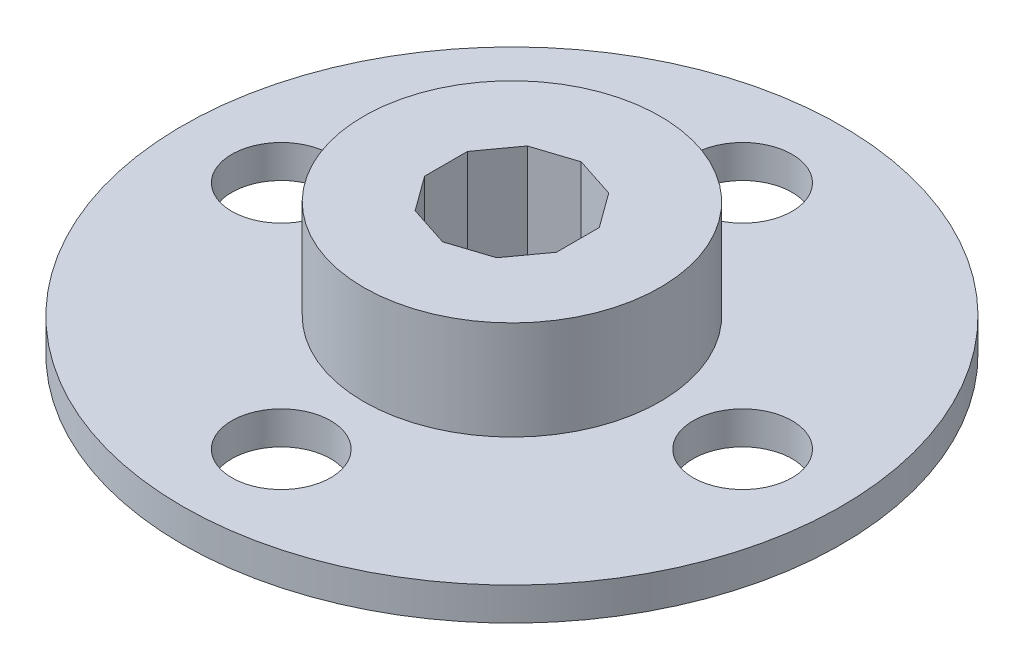
ISO-10303-21;
HEADER;
FILE_DESCRIPTION(('STEP AP214'),'2;1');
FILE_NAME('part.step','',(''),(''),'','','');
FILE_SCHEMA(('AUTOMOTIVE_DESIGN { 1 0 10303 214 1 1 1 1 }'));
ENDSEC;
DATA;
#1=APPLICATION_CONTEXT('core data for automotive mechanical design processes');
#2=APPLICATION_PROTOCOL_DEFINITION('international standard','automotive_design',2000,#1);
#3=PRODUCT_CONTEXT('',#1,'mechanical');
#4=PRODUCT('Part','Part','',(#3));
#5=PRODUCT_RELATED_PRODUCT_CATEGORY('part','',(#4));
#6=PRODUCT_DEFINITION_FORMATION('','',#4);
#7=PRODUCT_DEFINITION_CONTEXT('part definition',#1,'design');
#8=PRODUCT_DEFINITION('design','',#6,#7);
#9=PRODUCT_DEFINITION_SHAPE('','',#8);
#10=(LENGTH_UNIT() NAMED_UNIT(*) SI_UNIT(.MILLI.,.METRE.));
#11=(NAMED_UNIT(*) PLANE_ANGLE_UNIT() SI_UNIT($,.RADIAN.));
#12=(NAMED_UNIT(*) SI_UNIT($,.STERADIAN.) SOLID_ANGLE_UNIT());
#13=UNCERTAINTY_MEASURE_WITH_UNIT(LENGTH_MEASURE(1.E-05),#10,'distance_accuracy_value','');
#14=(GEOMETRIC_REPRESENTATION_CONTEXT(3) GLOBAL_UNCERTAINTY_ASSIGNED_CONTEXT((#13)) GLOBAL_UNIT_ASSIGNED_CONTEXT((#10,
#11,#12)) REPRESENTATION_CONTEXT('',''));
#15=CARTESIAN_POINT('',(0.,0.,0.));
#16=DIRECTION('',(0.,0.,1.));
#17=DIRECTION('',(1.,0.,0.));
#18=AXIS2_PLACEMENT_3D('',#15,#16,#17);
#19=CARTESIAN_POINT('',(0.,4.,0.));
#20=DIRECTION('',(0.,1.,0.));
#21=DIRECTION('',(0.,0.,1.));
#22=AXIS2_PLACEMENT_3D('',#19,#20,#21);
#23=PLANE('',#22);
#24=CARTESIAN_POINT('',(0.,4.,0.));
#25=DIRECTION('',(0.,1.,0.));
#26=DIRECTION('',(0.,0.,1.));
#27=AXIS2_PLACEMENT_3D('',#24,#25,#26);
#28=CIRCLE('',#27,4.5);
#29=CARTESIAN_POINT('',(0.,4.,4.5));
#30=VERTEX_POINT('',#29);
#31=EDGE_CURVE('E12',#30,#30,#28,.T.);
#32=ORIENTED_EDGE('',*,*,#31,.T.);
#33=EDGE_LOOP('',(#32));
#34=FACE_BOUND('',#33,.T.);
#35=DIRECTION('',(-0.587785252292474,0.,-0.809016994374947));
#36=VECTOR('',#35,1.);
#37=CARTESIAN_POINT('',(2.,4.,-0.649839392465813));
#38=LINE('',#37,#36);
#39=CARTESIAN_POINT('',(2.,4.,-0.649839392465813));
#40=VERTEX_POINT('',#39);
#41=CARTESIAN_POINT('',(1.23606797749979,4.,-1.70130161670408));
#42=VERTEX_POINT('',#41);
#43=EDGE_CURVE('E129',#40,#42,#38,.T.);
#44=ORIENTED_EDGE('',*,*,#43,.F.);
#45=DIRECTION('',(0.,0.,-1.));
#46=VECTOR('',#45,1.);
#47=CARTESIAN_POINT('',(2.,4.,0.649839392465812));
#48=LINE('',#47,#46);
#49=CARTESIAN_POINT('',(2.,4.,0.649839392465812));
#50=VERTEX_POINT('',#49);
#51=EDGE_CURVE('E121',#50,#40,#48,.T.);
#52=ORIENTED_EDGE('',*,*,#51,.F.);
#53=DIRECTION('',(0.587785252292473,0.,-0.809016994374948));
#54=VECTOR('',#53,1.);
#55=CARTESIAN_POINT('',(1.23606797749979,4.,1.70130161670408));
#56=LINE('',#55,#54);
#57=CARTESIAN_POINT('',(1.23606797749979,4.,1.70130161670408));
#58=VERTEX_POINT('',#57);
#59=EDGE_CURVE('E157',#58,#50,#56,.T.);
#60=ORIENTED_EDGE('',*,*,#59,.F.);
#61=DIRECTION('',(0.951056516295153,0.,-0.309016994374948));
#62=VECTOR('',#61,1.);
#63=CARTESIAN_POINT('',(0.,4.,2.10292444847653));
#64=LINE('',#63,#62);
#65=CARTESIAN_POINT('',(0.,4.,2.10292444847653));
#66=VERTEX_POINT('',#65);
#67=EDGE_CURVE('E155',#66,#58,#64,.T.);
#68=ORIENTED_EDGE('',*,*,#67,.F.);
#69=DIRECTION('',(0.951056516295154,0.,0.309016994374947));
#70=VECTOR('',#69,1.);
#71=CARTESIAN_POINT('',(-1.23606797749979,4.,1.70130161670408));
#72=LINE('',#71,#70);
#73=CARTESIAN_POINT('',(-1.23606797749979,4.,1.70130161670408));
#74=VERTEX_POINT('',#73);
#75=EDGE_CURVE('E153',#74,#66,#72,.T.);
#76=ORIENTED_EDGE('',*,*,#75,.F.);
#77=DIRECTION('',(0.587785252292473,0.,0.809016994374947));
#78=VECTOR('',#77,1.);
#79=CARTESIAN_POINT('',(-2.,4.,0.649839392465813));
#80=LINE('',#79,#78);
#81=CARTESIAN_POINT('',(-2.,4.,0.649839392465813));
#82=VERTEX_POINT('',#81);
#83=EDGE_CURVE('E151',#82,#74,#80,.T.);
#84=ORIENTED_EDGE('',*,*,#83,.F.);
#85=DIRECTION('',(0.,0.,1.));
#86=VECTOR('',#85,1.);
#87=CARTESIAN_POINT('',(-2.,4.,-0.649839392465812));
#88=LINE('',#87,#86);
#89=CARTESIAN_POINT('',(-2.,4.,-0.649839392465812));
#90=VERTEX_POINT('',#89);
#91=EDGE_CURVE('E149',#90,#82,#88,.T.);
#92=ORIENTED_EDGE('',*,*,#91,.F.);
#93=DIRECTION('',(-0.587785252292473,0.,0.809016994374948));
#94=VECTOR('',#93,1.);
#95=CARTESIAN_POINT('',(-1.23606797749979,4.,-1.70130161670408));
#96=LINE('',#95,#94);
#97=CARTESIAN_POINT('',(-1.23606797749979,4.,-1.70130161670408));
#98=VERTEX_POINT('',#97);
#99=EDGE_CURVE('E147',#98,#90,#96,.T.);
#100=ORIENTED_EDGE('',*,*,#99,.F.);
#101=DIRECTION('',(-0.951056516295154,0.,0.309016994374948));
#102=VECTOR('',#101,1.);
#103=CARTESIAN_POINT('',(0.,4.,-2.10292444847653));
#104=LINE('',#103,#102);
#105=CARTESIAN_POINT('',(0.,4.,-2.10292444847653));
#106=VERTEX_POINT('',#105);
#107=EDGE_CURVE('E143',#106,#98,#104,.T.);
#108=ORIENTED_EDGE('',*,*,#107,.F.);
#109=DIRECTION('',(-0.951056516295154,0.,-0.309016994374947));
#110=VECTOR('',#109,1.);
#111=CARTESIAN_POINT('',(1.23606797749979,4.,-1.70130161670408));
#112=LINE('',#111,#110);
#113=EDGE_CURVE('E141',#42,#106,#112,.T.);
#114=ORIENTED_EDGE('',*,*,#113,.F.);
#115=EDGE_LOOP('',(#44,#52,#60,#68,#76,#84,#92,#100,#108,#114));
#116=FACE_BOUND('',#115,.T.);
#117=ADVANCED_FACE('F44',(#34,#116),#23,.T.);
#118=CARTESIAN_POINT('',(0.,1.,0.));
#119=DIRECTION('',(0.,1.,0.));
#120=DIRECTION('',(0.,0.,1.));
#121=AXIS2_PLACEMENT_3D('',#118,#119,#120);
#122=PLANE('',#121);
#123=CARTESIAN_POINT('',(0.,1.,0.));
#124=DIRECTION('',(0.,1.,0.));
#125=DIRECTION('',(0.,0.,1.));
#126=AXIS2_PLACEMENT_3D('',#123,#124,#125);
#127=CIRCLE('',#126,4.5);
#128=CARTESIAN_POINT('',(0.,1.,4.5));
#129=VERTEX_POINT('',#128);
#130=EDGE_CURVE('E48',#129,#129,#127,.T.);
#131=ORIENTED_EDGE('',*,*,#130,.F.);
#132=EDGE_LOOP('',(#131));
#133=FACE_BOUND('',#132,.T.);
#134=DIRECTION('',(0.,0.,-1.));
#135=VECTOR('',#134,1.);
#136=CARTESIAN_POINT('',(2.,1.,0.649839392465812));
#137=LINE('',#136,#135);
#138=CARTESIAN_POINT('',(2.,1.,0.649839392465812));
#139=VERTEX_POINT('',#138);
#140=CARTESIAN_POINT('',(2.,1.,-0.649839392465813));
#141=VERTEX_POINT('',#140);
#142=EDGE_CURVE('E67',#139,#141,#137,.T.);
#143=ORIENTED_EDGE('',*,*,#142,.T.);
#144=DIRECTION('',(-0.587785252292474,0.,-0.809016994374947));
#145=VECTOR('',#144,1.);
#146=CARTESIAN_POINT('',(2.,1.,-0.649839392465813));
#147=LINE('',#146,#145);
#148=CARTESIAN_POINT('',(1.23606797749979,1.,-1.70130161670408));
#149=VERTEX_POINT('',#148);
#150=EDGE_CURVE('E136',#141,#149,#147,.T.);
#151=ORIENTED_EDGE('',*,*,#150,.T.);
#152=DIRECTION('',(-0.951056516295154,0.,-0.309016994374947));
#153=VECTOR('',#152,1.);
#154=CARTESIAN_POINT('',(1.23606797749979,1.,-1.70130161670408));
#155=LINE('',#154,#153);
#156=CARTESIAN_POINT('',(0.,1.,-2.10292444847653));
#157=VERTEX_POINT('',#156);
#158=EDGE_CURVE('E161',#149,#157,#155,.T.);
#159=ORIENTED_EDGE('',*,*,#158,.T.);
#160=DIRECTION('',(-0.951056516295154,0.,0.309016994374948));
#161=VECTOR('',#160,1.);
#162=CARTESIAN_POINT('',(0.,1.,-2.10292444847653));
#163=LINE('',#162,#161);
#164=CARTESIAN_POINT('',(-1.23606797749979,1.,-1.70130161670408));
#165=VERTEX_POINT('',#164);
#166=EDGE_CURVE('E164',#157,#165,#163,.T.);
#167=ORIENTED_EDGE('',*,*,#166,.T.);
#168=DIRECTION('',(-0.587785252292473,0.,0.809016994374948));
#169=VECTOR('',#168,1.);
#170=CARTESIAN_POINT('',(-1.23606797749979,1.,-1.70130161670408));
#171=LINE('',#170,#169);
#172=CARTESIAN_POINT('',(-2.,1.,-0.649839392465812));
#173=VERTEX_POINT('',#172);
#174=EDGE_CURVE('E167',#165,#173,#171,.T.);
#175=ORIENTED_EDGE('',*,*,#174,.T.);
#176=DIRECTION('',(0.,0.,1.));
#177=VECTOR('',#176,1.);
#178=CARTESIAN_POINT('',(-2.,1.,-0.649839392465812));
#179=LINE('',#178,#177);
#180=CARTESIAN_POINT('',(-2.,1.,0.649839392465813));
#181=VERTEX_POINT('',#180);
#182=EDGE_CURVE('E170',#173,#181,#179,.T.);
#183=ORIENTED_EDGE('',*,*,#182,.T.);
#184=DIRECTION('',(0.587785252292473,0.,0.809016994374947));
#185=VECTOR('',#184,1.);
#186=CARTESIAN_POINT('',(-2.,1.,0.649839392465813));
#187=LINE('',#186,#185);
#188=CARTESIAN_POINT('',(-1.23606797749979,1.,1.70130161670408));
#189=VERTEX_POINT('',#188);
#190=EDGE_CURVE('E173',#181,#189,#187,.T.);
#191=ORIENTED_EDGE('',*,*,#190,.T.);
#192=DIRECTION('',(0.951056516295154,0.,0.309016994374947));
#193=VECTOR('',#192,1.);
#194=CARTESIAN_POINT('',(-1.23606797749979,1.,1.70130161670408));
#195=LINE('',#194,#193);
#196=CARTESIAN_POINT('',(0.,1.,2.10292444847653));
#197=VERTEX_POINT('',#196);
#198=EDGE_CURVE('E176',#189,#197,#195,.T.);
#199=ORIENTED_EDGE('',*,*,#198,.T.);
#200=DIRECTION('',(0.951056516295153,0.,-0.309016994374948));
#201=VECTOR('',#200,1.);
#202=CARTESIAN_POINT('',(0.,1.,2.10292444847653));
#203=LINE('',#202,#201);
#204=CARTESIAN_POINT('',(1.23606797749979,1.,1.70130161670408));
#205=VERTEX_POINT('',#204);
#206=EDGE_CURVE('E179',#197,#205,#203,.T.);
#207=ORIENTED_EDGE('',*,*,#206,.T.);
#208=DIRECTION('',(0.587785252292473,0.,-0.809016994374948));
#209=VECTOR('',#208,1.);
#210=CARTESIAN_POINT('',(1.23606797749979,1.,1.70130161670408));
#211=LINE('',#210,#209);
#212=EDGE_CURVE('E130',#205,#139,#211,.T.);
#213=ORIENTED_EDGE('',*,*,#212,.T.);
#214=EDGE_LOOP('',(#143,#151,#159,#167,#175,#183,#191,#199,#207,#213));
#215=FACE_BOUND('',#214,.T.);
#216=ADVANCED_FACE('F204',(#133,#215),#122,.F.);
#217=CARTESIAN_POINT('',(0.,4.,0.));
#218=DIRECTION('',(0.,-1.,0.));
#219=DIRECTION('',(0.,0.,-1.));
#220=AXIS2_PLACEMENT_3D('',#217,#218,#219);
#221=CYLINDRICAL_SURFACE('',#220,4.5);
#222=ORIENTED_EDGE('',*,*,#31,.F.);
#223=EDGE_LOOP('',(#222));
#224=FACE_BOUND('',#223,.T.);
#225=ORIENTED_EDGE('',*,*,#130,.T.);
#226=EDGE_LOOP('',(#225));
#227=FACE_BOUND('',#226,.T.);
#228=ADVANCED_FACE('F46',(#224,#227),#221,.T.);
#229=CARTESIAN_POINT('',(2.,4.,0.649839392465812));
#230=DIRECTION('',(-1.,0.,0.));
#231=DIRECTION('',(0.,0.,1.));
#232=AXIS2_PLACEMENT_3D('',#229,#230,#231);
#233=PLANE('',#232);
#234=ORIENTED_EDGE('',*,*,#142,.F.);
#235=DIRECTION('',(0.,-1.,0.));
#236=VECTOR('',#235,1.);
#237=CARTESIAN_POINT('',(2.,4.,0.649839392465812));
#238=LINE('',#237,#236);
#239=EDGE_CURVE('E125',#50,#139,#238,.T.);
#240=ORIENTED_EDGE('',*,*,#239,.F.);
#241=ORIENTED_EDGE('',*,*,#51,.T.);
#242=DIRECTION('',(0.,-1.,0.));
#243=VECTOR('',#242,1.);
#244=CARTESIAN_POINT('',(2.,4.,-0.649839392465813));
#245=LINE('',#244,#243);
#246=EDGE_CURVE('E124',#40,#141,#245,.T.);
#247=ORIENTED_EDGE('',*,*,#246,.T.);
#248=EDGE_LOOP('',(#234,#240,#241,#247));
#249=FACE_BOUND('',#248,.T.);
#250=ADVANCED_FACE('F123',(#249),#233,.T.);
#251=CARTESIAN_POINT('',(2.,4.,-0.649839392465813));
#252=DIRECTION('',(-0.809016994374947,0.,0.587785252292473));
#253=DIRECTION('',(0.587785252292474,0.,0.809016994374947));
#254=AXIS2_PLACEMENT_3D('',#251,#252,#253);
#255=PLANE('',#254);
#256=ORIENTED_EDGE('',*,*,#150,.F.);
#257=ORIENTED_EDGE('',*,*,#246,.F.);
#258=ORIENTED_EDGE('',*,*,#43,.T.);
#259=DIRECTION('',(0.,-1.,0.));
#260=VECTOR('',#259,1.);
#261=CARTESIAN_POINT('',(1.23606797749979,4.,-1.70130161670408));
#262=LINE('',#261,#260);
#263=EDGE_CURVE('E137',#42,#149,#262,.T.);
#264=ORIENTED_EDGE('',*,*,#263,.T.);
#265=EDGE_LOOP('',(#256,#257,#258,#264));
#266=FACE_BOUND('',#265,.T.);
#267=ADVANCED_FACE('F133',(#266),#255,.T.);
#268=CARTESIAN_POINT('',(1.23606797749979,4.,-1.70130161670408));
#269=DIRECTION('',(-0.309016994374947,0.,0.951056516295154));
#270=DIRECTION('',(0.951056516295154,0.,0.309016994374947));
#271=AXIS2_PLACEMENT_3D('',#268,#269,#270);
#272=PLANE('',#271);
#273=ORIENTED_EDGE('',*,*,#158,.F.);
#274=ORIENTED_EDGE('',*,*,#263,.F.);
#275=ORIENTED_EDGE('',*,*,#113,.T.);
#276=DIRECTION('',(0.,-1.,0.));
#277=VECTOR('',#276,1.);
#278=CARTESIAN_POINT('',(0.,4.,-2.10292444847653));
#279=LINE('',#278,#277);
#280=EDGE_CURVE('E196',#106,#157,#279,.T.);
#281=ORIENTED_EDGE('',*,*,#280,.T.);
#282=EDGE_LOOP('',(#273,#274,#275,#281));
#283=FACE_BOUND('',#282,.T.);
#284=ADVANCED_FACE('F200',(#283),#272,.T.);
#285=CARTESIAN_POINT('',(0.,4.,-2.10292444847653));
#286=DIRECTION('',(0.309016994374948,0.,0.951056516295153));
#287=DIRECTION('',(0.951056516295154,0.,-0.309016994374948));
#288=AXIS2_PLACEMENT_3D('',#285,#286,#287);
#289=PLANE('',#288);
#290=ORIENTED_EDGE('',*,*,#166,.F.);
#291=ORIENTED_EDGE('',*,*,#280,.F.);
#292=ORIENTED_EDGE('',*,*,#107,.T.);
#293=DIRECTION('',(0.,-1.,0.));
#294=VECTOR('',#293,1.);
#295=CARTESIAN_POINT('',(-1.23606797749979,4.,-1.70130161670408));
#296=LINE('',#295,#294);
#297=EDGE_CURVE('E194',#98,#165,#296,.T.);
#298=ORIENTED_EDGE('',*,*,#297,.T.);
#299=EDGE_LOOP('',(#290,#291,#292,#298));
#300=FACE_BOUND('',#299,.T.);
#301=ADVANCED_FACE('F232',(#300),#289,.T.);
#302=CARTESIAN_POINT('',(-1.23606797749979,4.,-1.70130161670408));
#303=DIRECTION('',(0.809016994374947,0.,0.587785252292473));
#304=DIRECTION('',(0.587785252292473,0.,-0.809016994374948));
#305=AXIS2_PLACEMENT_3D('',#302,#303,#304);
#306=PLANE('',#305);
#307=ORIENTED_EDGE('',*,*,#174,.F.);
#308=ORIENTED_EDGE('',*,*,#297,.F.);
#309=ORIENTED_EDGE('',*,*,#99,.T.);
#310=DIRECTION('',(0.,-1.,0.));
#311=VECTOR('',#310,1.);
#312=CARTESIAN_POINT('',(-2.,4.,-0.649839392465812));
#313=LINE('',#312,#311);
#314=EDGE_CURVE('E192',#90,#173,#313,.T.);
#315=ORIENTED_EDGE('',*,*,#314,.T.);
#316=EDGE_LOOP('',(#307,#308,#309,#315));
#317=FACE_BOUND('',#316,.T.);
#318=ADVANCED_FACE('F229',(#317),#306,.T.);
#319=CARTESIAN_POINT('',(-2.,4.,-0.649839392465812));
#320=DIRECTION('',(1.,0.,0.));
#321=DIRECTION('',(0.,0.,-1.));
#322=AXIS2_PLACEMENT_3D('',#319,#320,#321);
#323=PLANE('',#322);
#324=ORIENTED_EDGE('',*,*,#182,.F.);
#325=ORIENTED_EDGE('',*,*,#314,.F.);
#326=ORIENTED_EDGE('',*,*,#91,.T.);
#327=DIRECTION('',(0.,-1.,0.));
#328=VECTOR('',#327,1.);
#329=CARTESIAN_POINT('',(-2.,4.,0.649839392465813));
#330=LINE('',#329,#328);
#331=EDGE_CURVE('E190',#82,#181,#330,.T.);
#332=ORIENTED_EDGE('',*,*,#331,.T.);
#333=EDGE_LOOP('',(#324,#325,#326,#332));
#334=FACE_BOUND('',#333,.T.);
#335=ADVANCED_FACE('F226',(#334),#323,.T.);
#336=CARTESIAN_POINT('',(-2.,4.,0.649839392465813));
#337=DIRECTION('',(0.809016994374947,0.,-0.587785252292473));
#338=DIRECTION('',(-0.587785252292473,0.,-0.809016994374947));
#339=AXIS2_PLACEMENT_3D('',#336,#337,#338);
#340=PLANE('',#339);
#341=ORIENTED_EDGE('',*,*,#190,.F.);
#342=ORIENTED_EDGE('',*,*,#331,.F.);
#343=ORIENTED_EDGE('',*,*,#83,.T.);
#344=DIRECTION('',(0.,-1.,0.));
#345=VECTOR('',#344,1.);
#346=CARTESIAN_POINT('',(-1.23606797749979,4.,1.70130161670408));
#347=LINE('',#346,#345);
#348=EDGE_CURVE('E188',#74,#189,#347,.T.);
#349=ORIENTED_EDGE('',*,*,#348,.T.);
#350=EDGE_LOOP('',(#341,#342,#343,#349));
#351=FACE_BOUND('',#350,.T.);
#352=ADVANCED_FACE('F219',(#351),#340,.T.);
#353=CARTESIAN_POINT('',(-1.23606797749979,4.,1.70130161670408));
#354=DIRECTION('',(0.309016994374947,0.,-0.951056516295154));
#355=DIRECTION('',(-0.951056516295154,0.,-0.309016994374947));
#356=AXIS2_PLACEMENT_3D('',#353,#354,#355);
#357=PLANE('',#356);
#358=ORIENTED_EDGE('',*,*,#198,.F.);
#359=ORIENTED_EDGE('',*,*,#348,.F.);
#360=ORIENTED_EDGE('',*,*,#75,.T.);
#361=DIRECTION('',(0.,-1.,0.));
#362=VECTOR('',#361,1.);
#363=CARTESIAN_POINT('',(0.,4.,2.10292444847653));
#364=LINE('',#363,#362);
#365=EDGE_CURVE('E186',#66,#197,#364,.T.);
#366=ORIENTED_EDGE('',*,*,#365,.T.);
#367=EDGE_LOOP('',(#358,#359,#360,#366));
#368=FACE_BOUND('',#367,.T.);
#369=ADVANCED_FACE('F215',(#368),#357,.T.);
#370=CARTESIAN_POINT('',(0.,4.,2.10292444847653));
#371=DIRECTION('',(-0.309016994374948,0.,-0.951056516295154));
#372=DIRECTION('',(-0.951056516295154,0.,0.309016994374948));
#373=AXIS2_PLACEMENT_3D('',#370,#371,#372);
#374=PLANE('',#373);
#375=ORIENTED_EDGE('',*,*,#206,.F.);
#376=ORIENTED_EDGE('',*,*,#365,.F.);
#377=ORIENTED_EDGE('',*,*,#67,.T.);
#378=DIRECTION('',(0.,-1.,0.));
#379=VECTOR('',#378,1.);
#380=CARTESIAN_POINT('',(1.23606797749979,4.,1.70130161670408));
#381=LINE('',#380,#379);
#382=EDGE_CURVE('E59',#58,#205,#381,.T.);
#383=ORIENTED_EDGE('',*,*,#382,.T.);
#384=EDGE_LOOP('',(#375,#376,#377,#383));
#385=FACE_BOUND('',#384,.T.);
#386=ADVANCED_FACE('F212',(#385),#374,.T.);
#387=CARTESIAN_POINT('',(1.23606797749979,4.,1.70130161670408));
#388=DIRECTION('',(-0.809016994374948,0.,-0.587785252292473));
#389=DIRECTION('',(-0.587785252292473,0.,0.809016994374948));
#390=AXIS2_PLACEMENT_3D('',#387,#388,#389);
#391=PLANE('',#390);
#392=ORIENTED_EDGE('',*,*,#212,.F.);
#393=ORIENTED_EDGE('',*,*,#382,.F.);
#394=ORIENTED_EDGE('',*,*,#59,.T.);
#395=ORIENTED_EDGE('',*,*,#239,.T.);
#396=EDGE_LOOP('',(#392,#393,#394,#395));
#397=FACE_BOUND('',#396,.T.);
#398=ADVANCED_FACE('F206',(#397),#391,.T.);
#399=CLOSED_SHELL('',(#117,#216,#228,#250,#267,#284,#301,#318,#335,#352,#369,#386,#398));
#400=MANIFOLD_SOLID_BREP('B2',#399);
#401=CARTESIAN_POINT('',(0.,1.,0.));
#402=DIRECTION('',(0.,1.,0.));
#403=DIRECTION('',(0.,0.,1.));
#404=AXIS2_PLACEMENT_3D('',#401,#402,#403);
#405=PLANE('',#404);
#406=CARTESIAN_POINT('',(0.,1.,7.));
#407=DIRECTION('',(0.,1.,0.));
#408=DIRECTION('',(0.,0.,1.));
#409=AXIS2_PLACEMENT_3D('',#406,#407,#408);
#410=CIRCLE('',#409,1.5);
#411=CARTESIAN_POINT('',(0.,1.,8.5));
#412=VERTEX_POINT('',#411);
#413=EDGE_CURVE('E372',#412,#412,#410,.T.);
#414=ORIENTED_EDGE('',*,*,#413,.F.);
#415=EDGE_LOOP('',(#414));
#416=FACE_BOUND('',#415,.T.);
#417=CARTESIAN_POINT('',(0.,1.,0.));
#418=DIRECTION('',(0.,1.,0.));
#419=DIRECTION('',(0.,0.,1.));
#420=AXIS2_PLACEMENT_3D('',#417,#418,#419);
#421=CIRCLE('',#420,4.5);
#422=CARTESIAN_POINT('',(0.,1.,4.5));
#423=VERTEX_POINT('',#422);
#424=EDGE_CURVE('E360',#423,#423,#421,.T.);
#425=ORIENTED_EDGE('',*,*,#424,.F.);
#426=EDGE_LOOP('',(#425));
#427=FACE_BOUND('',#426,.T.);
#428=CARTESIAN_POINT('',(0.,1.,0.));
#429=DIRECTION('',(0.,1.,0.));
#430=DIRECTION('',(0.,0.,1.));
#431=AXIS2_PLACEMENT_3D('',#428,#429,#430);
#432=CIRCLE('',#431,10.);
#433=CARTESIAN_POINT('',(0.,1.,10.));
#434=VERTEX_POINT('',#433);
#435=EDGE_CURVE('E43',#434,#434,#432,.T.);
#436=ORIENTED_EDGE('',*,*,#435,.T.);
#437=EDGE_LOOP('',(#436));
#438=FACE_BOUND('',#437,.T.);
#439=CARTESIAN_POINT('',(0.,1.,-7.));
#440=DIRECTION('',(0.,1.,0.));
#441=DIRECTION('',(0.,0.,1.));
#442=AXIS2_PLACEMENT_3D('',#439,#440,#441);
#443=CIRCLE('',#442,1.5);
#444=CARTESIAN_POINT('',(0.,1.,-5.5));
#445=VERTEX_POINT('',#444);
#446=EDGE_CURVE('E355',#445,#445,#443,.T.);
#447=ORIENTED_EDGE('',*,*,#446,.F.);
#448=EDGE_LOOP('',(#447));
#449=FACE_BOUND('',#448,.T.);
#450=CARTESIAN_POINT('',(7.,1.,0.));
#451=DIRECTION('',(0.,1.,0.));
#452=DIRECTION('',(0.,0.,1.));
#453=AXIS2_PLACEMENT_3D('',#450,#451,#452);
#454=CIRCLE('',#453,1.5);
#455=CARTESIAN_POINT('',(7.,1.,1.5));
#456=VERTEX_POINT('',#455);
#457=EDGE_CURVE('E366',#456,#456,#454,.T.);
#458=ORIENTED_EDGE('',*,*,#457,.F.);
#459=EDGE_LOOP('',(#458));
#460=FACE_BOUND('',#459,.T.);
#461=CARTESIAN_POINT('',(-7.,1.,0.));
#462=DIRECTION('',(0.,1.,0.));
#463=DIRECTION('',(0.,0.,1.));
#464=AXIS2_PLACEMENT_3D('',#461,#462,#463);
#465=CIRCLE('',#464,1.5);
#466=CARTESIAN_POINT('',(-7.,1.,1.5));
#467=VERTEX_POINT('',#466);
#468=EDGE_CURVE('E378',#467,#467,#465,.T.);
#469=ORIENTED_EDGE('',*,*,#468,.F.);
#470=EDGE_LOOP('',(#469));
#471=FACE_BOUND('',#470,.T.);
#472=ADVANCED_FACE('F344',(#416,#427,#438,#449,#460,#471),#405,.T.);
#473=CARTESIAN_POINT('',(0.,0.,0.));
#474=DIRECTION('',(0.,1.,0.));
#475=DIRECTION('',(0.,0.,1.));
#476=AXIS2_PLACEMENT_3D('',#473,#474,#475);
#477=PLANE('',#476);
#478=CARTESIAN_POINT('',(0.,0.,0.));
#479=DIRECTION('',(0.,1.,0.));
#480=DIRECTION('',(0.,0.,1.));
#481=AXIS2_PLACEMENT_3D('',#478,#479,#480);
#482=CIRCLE('',#481,10.);
#483=CARTESIAN_POINT('',(0.,0.,10.));
#484=VERTEX_POINT('',#483);
#485=EDGE_CURVE('E348',#484,#484,#482,.T.);
#486=ORIENTED_EDGE('',*,*,#485,.F.);
#487=EDGE_LOOP('',(#486));
#488=FACE_BOUND('',#487,.T.);
#489=CARTESIAN_POINT('',(0.,0.,-7.));
#490=DIRECTION('',(0.,1.,0.));
#491=DIRECTION('',(0.,0.,1.));
#492=AXIS2_PLACEMENT_3D('',#489,#490,#491);
#493=CIRCLE('',#492,1.5);
#494=CARTESIAN_POINT('',(0.,0.,-5.5));
#495=VERTEX_POINT('',#494);
#496=EDGE_CURVE('E357',#495,#495,#493,.T.);
#497=ORIENTED_EDGE('',*,*,#496,.T.);
#498=EDGE_LOOP('',(#497));
#499=FACE_BOUND('',#498,.T.);
#500=CARTESIAN_POINT('',(0.,0.,0.));
#501=DIRECTION('',(0.,1.,0.));
#502=DIRECTION('',(0.,0.,1.));
#503=AXIS2_PLACEMENT_3D('',#500,#501,#502);
#504=CIRCLE('',#503,4.5);
#505=CARTESIAN_POINT('',(0.,0.,4.5));
#506=VERTEX_POINT('',#505);
#507=EDGE_CURVE('E363',#506,#506,#504,.T.);
#508=ORIENTED_EDGE('',*,*,#507,.T.);
#509=EDGE_LOOP('',(#508));
#510=FACE_BOUND('',#509,.T.);
#511=CARTESIAN_POINT('',(7.,0.,0.));
#512=DIRECTION('',(0.,1.,0.));
#513=DIRECTION('',(0.,0.,1.));
#514=AXIS2_PLACEMENT_3D('',#511,#512,#513);
#515=CIRCLE('',#514,1.5);
#516=CARTESIAN_POINT('',(7.,0.,1.5));
#517=VERTEX_POINT('',#516);
#518=EDGE_CURVE('E369',#517,#517,#515,.T.);
#519=ORIENTED_EDGE('',*,*,#518,.T.);
#520=EDGE_LOOP('',(#519));
#521=FACE_BOUND('',#520,.T.);
#522=CARTESIAN_POINT('',(0.,0.,7.));
#523=DIRECTION('',(0.,1.,0.));
#524=DIRECTION('',(0.,0.,1.));
#525=AXIS2_PLACEMENT_3D('',#522,#523,#524);
#526=CIRCLE('',#525,1.5);
#527=CARTESIAN_POINT('',(0.,0.,8.5));
#528=VERTEX_POINT('',#527);
#529=EDGE_CURVE('E375',#528,#528,#526,.T.);
#530=ORIENTED_EDGE('',*,*,#529,.T.);
#531=EDGE_LOOP('',(#530));
#532=FACE_BOUND('',#531,.T.);
#533=CARTESIAN_POINT('',(-7.,0.,0.));
#534=DIRECTION('',(0.,1.,0.));
#535=DIRECTION('',(0.,0.,1.));
#536=AXIS2_PLACEMENT_3D('',#533,#534,#535);
#537=CIRCLE('',#536,1.5);
#538=CARTESIAN_POINT('',(-7.,0.,1.5));
#539=VERTEX_POINT('',#538);
#540=EDGE_CURVE('E381',#539,#539,#537,.T.);
#541=ORIENTED_EDGE('',*,*,#540,.T.);
#542=EDGE_LOOP('',(#541));
#543=FACE_BOUND('',#542,.T.);
#544=ADVANCED_FACE('F391',(#488,#499,#510,#521,#532,#543),#477,.F.);
#545=CARTESIAN_POINT('',(0.,1.,0.));
#546=DIRECTION('',(0.,-1.,0.));
#547=DIRECTION('',(0.,0.,-1.));
#548=AXIS2_PLACEMENT_3D('',#545,#546,#547);
#549=CYLINDRICAL_SURFACE('',#548,10.);
#550=ORIENTED_EDGE('',*,*,#435,.F.);
#551=EDGE_LOOP('',(#550));
#552=FACE_BOUND('',#551,.T.);
#553=ORIENTED_EDGE('',*,*,#485,.T.);
#554=EDGE_LOOP('',(#553));
#555=FACE_BOUND('',#554,.T.);
#556=ADVANCED_FACE('F346',(#552,#555),#549,.T.);
#557=CARTESIAN_POINT('',(0.,1.,-7.));
#558=DIRECTION('',(0.,-1.,0.));
#559=DIRECTION('',(0.,0.,-1.));
#560=AXIS2_PLACEMENT_3D('',#557,#558,#559);
#561=CYLINDRICAL_SURFACE('',#560,1.5);
#562=ORIENTED_EDGE('',*,*,#446,.T.);
#563=EDGE_LOOP('',(#562));
#564=FACE_BOUND('',#563,.T.);
#565=ORIENTED_EDGE('',*,*,#496,.F.);
#566=EDGE_LOOP('',(#565));
#567=FACE_BOUND('',#566,.T.);
#568=ADVANCED_FACE('F401',(#564,#567),#561,.F.);
#569=CARTESIAN_POINT('',(0.,1.,0.));
#570=DIRECTION('',(0.,-1.,0.));
#571=DIRECTION('',(0.,0.,-1.));
#572=AXIS2_PLACEMENT_3D('',#569,#570,#571);
#573=CYLINDRICAL_SURFACE('',#572,4.5);
#574=ORIENTED_EDGE('',*,*,#424,.T.);
#575=EDGE_LOOP('',(#574));
#576=FACE_BOUND('',#575,.T.);
#577=ORIENTED_EDGE('',*,*,#507,.F.);
#578=EDGE_LOOP('',(#577));
#579=FACE_BOUND('',#578,.T.);
#580=ADVANCED_FACE('F404',(#576,#579),#573,.F.);
#581=CARTESIAN_POINT('',(7.,1.,0.));
#582=DIRECTION('',(0.,-1.,0.));
#583=DIRECTION('',(0.,0.,-1.));
#584=AXIS2_PLACEMENT_3D('',#581,#582,#583);
#585=CYLINDRICAL_SURFACE('',#584,1.5);
#586=ORIENTED_EDGE('',*,*,#457,.T.);
#587=EDGE_LOOP('',(#586));
#588=FACE_BOUND('',#587,.T.);
#589=ORIENTED_EDGE('',*,*,#518,.F.);
#590=EDGE_LOOP('',(#589));
#591=FACE_BOUND('',#590,.T.);
#592=ADVANCED_FACE('F408',(#588,#591),#585,.F.);
#593=CARTESIAN_POINT('',(0.,1.,7.));
#594=DIRECTION('',(0.,-1.,0.));
#595=DIRECTION('',(0.,0.,-1.));
#596=AXIS2_PLACEMENT_3D('',#593,#594,#595);
#597=CYLINDRICAL_SURFACE('',#596,1.5);
#598=ORIENTED_EDGE('',*,*,#413,.T.);
#599=EDGE_LOOP('',(#598));
#600=FACE_BOUND('',#599,.T.);
#601=ORIENTED_EDGE('',*,*,#529,.F.);
#602=EDGE_LOOP('',(#601));
#603=FACE_BOUND('',#602,.T.);
#604=ADVANCED_FACE('F412',(#600,#603),#597,.F.);
#605=CARTESIAN_POINT('',(-7.,1.,0.));
#606=DIRECTION('',(0.,-1.,0.));
#607=DIRECTION('',(0.,0.,-1.));
#608=AXIS2_PLACEMENT_3D('',#605,#606,#607);
#609=CYLINDRICAL_SURFACE('',#608,1.5);
#610=ORIENTED_EDGE('',*,*,#468,.T.);
#611=EDGE_LOOP('',(#610));
#612=FACE_BOUND('',#611,.T.);
#613=ORIENTED_EDGE('',*,*,#540,.F.);
#614=EDGE_LOOP('',(#613));
#615=FACE_BOUND('',#614,.T.);
#616=ADVANCED_FACE('F387',(#612,#615),#609,.F.);
#617=CLOSED_SHELL('',(#472,#544,#556,#568,#580,#592,#604,#616));
#618=MANIFOLD_SOLID_BREP('B6',#617);
#619=ADVANCED_BREP_SHAPE_REPRESENTATION('',(#18,#400,#618),#14);
#620=SHAPE_DEFINITION_REPRESENTATION(#9,#619);
ENDSEC;
END-ISO-10303-21;
